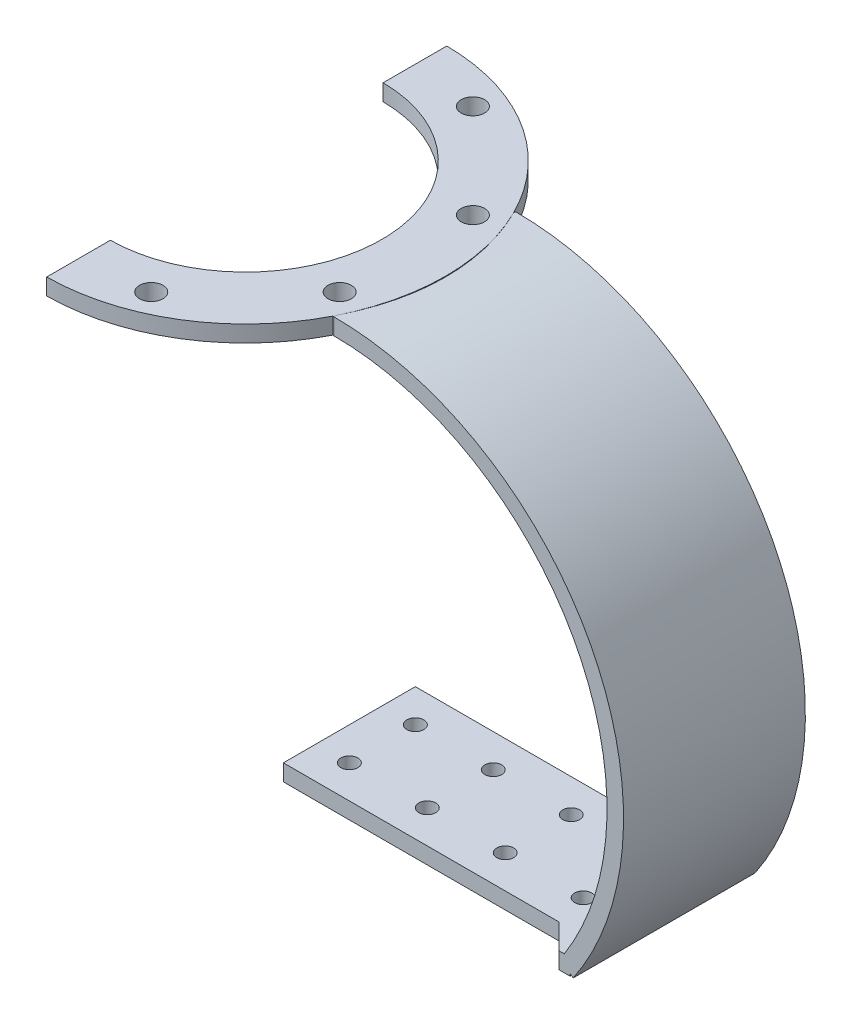
ISO-10303-21;
HEADER;
FILE_DESCRIPTION(('STEP AP214'),'2;1');
FILE_NAME('part.step','',(''),(''),'','','');
FILE_SCHEMA(('AUTOMOTIVE_DESIGN { 1 0 10303 214 1 1 1 1 }'));
ENDSEC;
DATA;
#1=APPLICATION_CONTEXT('core data for automotive mechanical design processes');
#2=APPLICATION_PROTOCOL_DEFINITION('international standard','automotive_design',2000,#1);
#3=PRODUCT_CONTEXT('',#1,'mechanical');
#4=PRODUCT('Part','Part','',(#3));
#5=PRODUCT_RELATED_PRODUCT_CATEGORY('part','',(#4));
#6=PRODUCT_DEFINITION_FORMATION('','',#4);
#7=PRODUCT_DEFINITION_CONTEXT('part definition',#1,'design');
#8=PRODUCT_DEFINITION('design','',#6,#7);
#9=PRODUCT_DEFINITION_SHAPE('','',#8);
#10=(LENGTH_UNIT() NAMED_UNIT(*) SI_UNIT(.MILLI.,.METRE.));
#11=(NAMED_UNIT(*) PLANE_ANGLE_UNIT() SI_UNIT($,.RADIAN.));
#12=(NAMED_UNIT(*) SI_UNIT($,.STERADIAN.) SOLID_ANGLE_UNIT());
#13=UNCERTAINTY_MEASURE_WITH_UNIT(LENGTH_MEASURE(1.E-05),#10,'distance_accuracy_value','');
#14=(GEOMETRIC_REPRESENTATION_CONTEXT(3) GLOBAL_UNCERTAINTY_ASSIGNED_CONTEXT((#13)) GLOBAL_UNIT_ASSIGNED_CONTEXT((#10,
#11,#12)) REPRESENTATION_CONTEXT('',''));
#15=CARTESIAN_POINT('',(0.,0.,0.));
#16=DIRECTION('',(0.,0.,1.));
#17=DIRECTION('',(1.,0.,0.));
#18=AXIS2_PLACEMENT_3D('',#15,#16,#17);
#19=CARTESIAN_POINT('',(0.,84.005,0.));
#20=DIRECTION('',(0.,1.,0.));
#21=DIRECTION('',(0.,0.,1.));
#22=AXIS2_PLACEMENT_3D('',#19,#20,#21);
#23=CYLINDRICAL_SURFACE('',#22,38.5);
#24=CARTESIAN_POINT('',(0.,87.18,0.));
#25=DIRECTION('',(0.,1.,0.));
#26=DIRECTION('',(0.,0.,1.));
#27=AXIS2_PLACEMENT_3D('',#24,#25,#26);
#28=CIRCLE('',#27,38.5);
#29=CARTESIAN_POINT('',(34.5,87.18,-17.0880074906351));
#30=VERTEX_POINT('',#29);
#31=CARTESIAN_POINT('',(0.250000000000008,87.18,-38.4991883031318));
#32=VERTEX_POINT('',#31);
#33=EDGE_CURVE('E323',#30,#32,#28,.T.);
#34=ORIENTED_EDGE('',*,*,#33,.F.);
#35=DIRECTION('',(0.,1.,0.));
#36=VECTOR('',#35,1.);
#37=CARTESIAN_POINT('',(34.5,84.005,-17.0880074906351));
#38=LINE('',#37,#36);
#39=CARTESIAN_POINT('',(34.5,84.005,-17.0880074906351));
#40=VERTEX_POINT('',#39);
#41=EDGE_CURVE('E249',#30,#40,#38,.F.);
#42=ORIENTED_EDGE('',*,*,#41,.T.);
#43=CARTESIAN_POINT('',(0.,84.005,0.));
#44=DIRECTION('',(0.,1.,0.));
#45=DIRECTION('',(0.,0.,1.));
#46=AXIS2_PLACEMENT_3D('',#43,#44,#45);
#47=CIRCLE('',#46,38.5);
#48=CARTESIAN_POINT('',(0.250000000000008,84.005,-38.4991883031318));
#49=VERTEX_POINT('',#48);
#50=EDGE_CURVE('E388',#40,#49,#47,.T.);
#51=ORIENTED_EDGE('',*,*,#50,.T.);
#52=DIRECTION('',(0.,1.,0.));
#53=VECTOR('',#52,1.);
#54=CARTESIAN_POINT('',(0.250000000000008,84.005,-38.4991883031318));
#55=LINE('',#54,#53);
#56=EDGE_CURVE('E349',#49,#32,#55,.T.);
#57=ORIENTED_EDGE('',*,*,#56,.T.);
#58=EDGE_LOOP('',(#34,#42,#51,#57));
#59=FACE_BOUND('',#58,.T.);
#60=ADVANCED_FACE('F40',(#59),#23,.T.);
#61=CARTESIAN_POINT('',(0.250000000000008,84.005,38.4991883031318));
#62=VERTEX_POINT('',#61);
#63=CARTESIAN_POINT('',(34.3043572998505,84.005,17.4774446142506));
#64=VERTEX_POINT('',#63);
#65=EDGE_CURVE('E380',#62,#64,#47,.T.);
#66=ORIENTED_EDGE('',*,*,#65,.T.);
#67=DIRECTION('',(0.,1.,0.));
#68=VECTOR('',#67,1.);
#69=CARTESIAN_POINT('',(34.3043572998505,84.005,17.4774446142506));
#70=LINE('',#69,#68);
#71=CARTESIAN_POINT('',(34.3043572998505,87.18,17.4774446142506));
#72=VERTEX_POINT('',#71);
#73=EDGE_CURVE('E369',#64,#72,#70,.T.);
#74=ORIENTED_EDGE('',*,*,#73,.T.);
#75=CARTESIAN_POINT('',(0.250000000000008,87.18,38.4991883031318));
#76=VERTEX_POINT('',#75);
#77=EDGE_CURVE('E322',#76,#72,#28,.T.);
#78=ORIENTED_EDGE('',*,*,#77,.F.);
#79=DIRECTION('',(0.,1.,0.));
#80=VECTOR('',#79,1.);
#81=CARTESIAN_POINT('',(0.250000000000008,84.005,38.4991883031318));
#82=LINE('',#81,#80);
#83=EDGE_CURVE('E352',#62,#76,#82,.T.);
#84=ORIENTED_EDGE('',*,*,#83,.F.);
#85=EDGE_LOOP('',(#66,#74,#78,#84));
#86=FACE_BOUND('',#85,.T.);
#87=ADVANCED_FACE('F307',(#86),#23,.T.);
#88=CARTESIAN_POINT('',(34.5,87.18,17.0880074906351));
#89=VERTEX_POINT('',#88);
#90=EDGE_CURVE('E320',#89,#30,#28,.T.);
#91=ORIENTED_EDGE('',*,*,#90,.F.);
#92=CARTESIAN_POINT('',(34.5,87.18,17.0880074906351));
#93=CARTESIAN_POINT('',(34.7401927640667,87.1799907951061,16.6030828400303));
#94=CARTESIAN_POINT('',(34.9701457065483,87.178447928796,16.1130960920916));
#95=CARTESIAN_POINT('',(35.4091913129783,87.1730228010982,15.1238839267135));
#96=CARTESIAN_POINT('',(35.6182842464073,87.1691405699361,14.6246586287212));
#97=CARTESIAN_POINT('',(36.0152270544095,87.1597648001595,13.6178635447017));
#98=CARTESIAN_POINT('',(36.2030778245849,87.1542713295123,13.1102941115103));
#99=CARTESIAN_POINT('',(36.5572091053214,87.1423241961017,12.0877344994361));
#100=CARTESIAN_POINT('',(36.7234895768662,87.1358705316016,11.5727443071327));
#101=CARTESIAN_POINT('',(37.1892608084199,87.1159940373502,10.0188357442367));
#102=CARTESIAN_POINT('',(37.4560986698537,87.1020432835709,8.96992051816567));
#103=CARTESIAN_POINT('',(37.9005169318116,87.0766727235012,6.85349520160396));
#104=CARTESIAN_POINT('',(38.0780997773165,87.0652528478866,5.78598562130117));
#105=CARTESIAN_POINT('',(38.3429186735553,87.0475958289183,3.63887190418253));
#106=CARTESIAN_POINT('',(38.4300827573942,87.041362814716,2.55925882356517));
#107=CARTESIAN_POINT('',(38.5131676446332,87.0354310203258,0.396450495344081));
#108=CARTESIAN_POINT('',(38.5090831864638,87.0357326169362,-0.686744955225307));
#109=CARTESIAN_POINT('',(38.4097312263332,87.0428032052197,-2.84822175972691));
#110=CARTESIAN_POINT('',(38.3145210417669,87.0495681315025,-3.92650577457537));
#111=CARTESIAN_POINT('',(38.0336858521719,87.0681118727003,-6.07105913989562));
#112=CARTESIAN_POINT('',(37.8480780515927,87.0798897335013,-7.13733073707534));
#113=CARTESIAN_POINT('',(37.4503465626107,87.1021519162474,-8.96338799679643));
#114=CARTESIAN_POINT('',(37.2590978343101,87.1121194886817,-9.72779945225761));
#115=CARTESIAN_POINT('',(36.8301090226141,87.1317140108851,-11.2433575823781));
#116=CARTESIAN_POINT('',(36.5923776665228,87.1413410241955,-11.994506718272));
#117=CARTESIAN_POINT('',(36.0714173850146,87.1584676330549,-13.4804395820254));
#118=CARTESIAN_POINT('',(35.7882120005232,87.165968323829,-14.2152315547382));
#119=CARTESIAN_POINT('',(35.177246424625,87.1767129488566,-15.6662628992205));
#120=CARTESIAN_POINT('',(34.8494769300242,87.1799559927741,-16.3824983598676));
#121=CARTESIAN_POINT('',(34.5,87.18,-17.0880074906351));
#122=B_SPLINE_CURVE_WITH_KNOTS('',3,(#92,#93,#94,#95,#96,#97,#98,#99,#100,#101,#102,#103,#104,
#105,#106,#107,#108,#109,#110,#111,#112,#113,#114,#115,#116,#117,#118,#119,#120,#121),
.UNSPECIFIED.,.F.,.F.,(4,2,2,2,2,2,2,2,2,2,2,2,2,2,4),(0.,1.62331568564605,3.24661039772908,
4.86983664367539,6.49306582566813,9.73612046284146,12.979086257514,16.2246312461284,
19.4703633797002,22.7140553129832,25.9571301488043,28.3198546750462,30.6821360153004,
33.0431983728157,35.4047543841795),.UNSPECIFIED.);
#123=EDGE_CURVE('E240',#89,#30,#122,.T.);
#124=ORIENTED_EDGE('',*,*,#123,.T.);
#125=EDGE_LOOP('',(#91,#124));
#126=FACE_BOUND('',#125,.T.);
#127=ADVANCED_FACE('F302',(#126),#23,.T.);
#128=CARTESIAN_POINT('',(0.,84.005,0.));
#129=DIRECTION('',(0.,1.,0.));
#130=DIRECTION('',(0.,0.,1.));
#131=AXIS2_PLACEMENT_3D('',#128,#129,#130);
#132=CYLINDRICAL_SURFACE('',#131,26.25);
#133=CARTESIAN_POINT('',(0.,87.18,0.));
#134=DIRECTION('',(0.,1.,0.));
#135=DIRECTION('',(0.,0.,1.));
#136=AXIS2_PLACEMENT_3D('',#133,#134,#135);
#137=CIRCLE('',#136,26.25);
#138=CARTESIAN_POINT('',(0.250000000000008,87.18,26.2488094968134));
#139=VERTEX_POINT('',#138);
#140=CARTESIAN_POINT('',(0.250000000000008,87.18,-26.2488094968134));
#141=VERTEX_POINT('',#140);
#142=EDGE_CURVE('E400',#139,#141,#137,.T.);
#143=ORIENTED_EDGE('',*,*,#142,.T.);
#144=DIRECTION('',(0.,1.,0.));
#145=VECTOR('',#144,1.);
#146=CARTESIAN_POINT('',(0.250000000000008,84.005,-26.2488094968134));
#147=LINE('',#146,#145);
#148=CARTESIAN_POINT('',(0.250000000000008,84.005,-26.2488094968134));
#149=VERTEX_POINT('',#148);
#150=EDGE_CURVE('E346',#149,#141,#147,.T.);
#151=ORIENTED_EDGE('',*,*,#150,.F.);
#152=CARTESIAN_POINT('',(0.,84.005,0.));
#153=DIRECTION('',(0.,1.,0.));
#154=DIRECTION('',(0.,0.,1.));
#155=AXIS2_PLACEMENT_3D('',#152,#153,#154);
#156=CIRCLE('',#155,26.25);
#157=CARTESIAN_POINT('',(0.250000000000008,84.005,26.2488094968134));
#158=VERTEX_POINT('',#157);
#159=EDGE_CURVE('E345',#158,#149,#156,.T.);
#160=ORIENTED_EDGE('',*,*,#159,.F.);
#161=DIRECTION('',(0.,1.,0.));
#162=VECTOR('',#161,1.);
#163=CARTESIAN_POINT('',(0.250000000000008,84.005,26.2488094968134));
#164=LINE('',#163,#162);
#165=EDGE_CURVE('E354',#158,#139,#164,.T.);
#166=ORIENTED_EDGE('',*,*,#165,.T.);
#167=EDGE_LOOP('',(#143,#151,#160,#166));
#168=FACE_BOUND('',#167,.T.);
#169=ADVANCED_FACE('F297',(#168),#132,.F.);
#170=CARTESIAN_POINT('',(0.250000000000008,84.005,0.));
#171=DIRECTION('',(-1.,0.,0.));
#172=DIRECTION('',(0.,0.,1.));
#173=AXIS2_PLACEMENT_3D('',#170,#171,#172);
#174=PLANE('',#173);
#175=DIRECTION('',(0.,0.,1.));
#176=VECTOR('',#175,1.);
#177=CARTESIAN_POINT('',(0.250000000000008,87.18,0.));
#178=LINE('',#177,#176);
#179=EDGE_CURVE('E326',#32,#141,#178,.T.);
#180=ORIENTED_EDGE('',*,*,#179,.F.);
#181=ORIENTED_EDGE('',*,*,#56,.F.);
#182=DIRECTION('',(0.,0.,1.));
#183=VECTOR('',#182,1.);
#184=CARTESIAN_POINT('',(0.250000000000008,84.005,0.));
#185=LINE('',#184,#183);
#186=EDGE_CURVE('E387',#49,#149,#185,.T.);
#187=ORIENTED_EDGE('',*,*,#186,.T.);
#188=ORIENTED_EDGE('',*,*,#150,.T.);
#189=EDGE_LOOP('',(#180,#181,#187,#188));
#190=FACE_BOUND('',#189,.T.);
#191=ADVANCED_FACE('F288',(#190),#174,.T.);
#192=CARTESIAN_POINT('',(30.9499643391282,84.005,12.8198949842303));
#193=DIRECTION('',(0.,1.,0.));
#194=DIRECTION('',(0.,0.,1.));
#195=AXIS2_PLACEMENT_3D('',#192,#193,#194);
#196=CYLINDRICAL_SURFACE('',#195,2.25);
#197=CARTESIAN_POINT('',(30.9499643391282,84.005,12.8198949842303));
#198=DIRECTION('',(0.,1.,0.));
#199=DIRECTION('',(0.,0.,1.));
#200=AXIS2_PLACEMENT_3D('',#197,#198,#199);
#201=CIRCLE('',#200,2.25);
#202=CARTESIAN_POINT('',(30.9499643391282,84.005,15.0698949842303));
#203=VERTEX_POINT('',#202);
#204=EDGE_CURVE('E407',#203,#203,#201,.T.);
#205=ORIENTED_EDGE('',*,*,#204,.F.);
#206=EDGE_LOOP('',(#205));
#207=FACE_BOUND('',#206,.T.);
#208=CARTESIAN_POINT('',(30.9499643391282,87.18,12.8198949842303));
#209=DIRECTION('',(0.,1.,0.));
#210=DIRECTION('',(0.,0.,1.));
#211=AXIS2_PLACEMENT_3D('',#208,#209,#210);
#212=CIRCLE('',#211,2.25);
#213=CARTESIAN_POINT('',(30.9499643391282,87.18,15.0698949842303));
#214=VERTEX_POINT('',#213);
#215=EDGE_CURVE('E339',#214,#214,#212,.T.);
#216=ORIENTED_EDGE('',*,*,#215,.T.);
#217=EDGE_LOOP('',(#216));
#218=FACE_BOUND('',#217,.T.);
#219=ADVANCED_FACE('F284',(#207,#218),#196,.F.);
#220=CARTESIAN_POINT('',(30.9499643391281,84.005,-12.8198949842307));
#221=DIRECTION('',(0.,1.,0.));
#222=DIRECTION('',(0.,0.,1.));
#223=AXIS2_PLACEMENT_3D('',#220,#221,#222);
#224=CYLINDRICAL_SURFACE('',#223,2.25);
#225=CARTESIAN_POINT('',(30.9499643391281,84.005,-12.8198949842307));
#226=DIRECTION('',(0.,1.,0.));
#227=DIRECTION('',(0.,0.,1.));
#228=AXIS2_PLACEMENT_3D('',#225,#226,#227);
#229=CIRCLE('',#228,2.25);
#230=CARTESIAN_POINT('',(30.9499643391281,84.005,-10.5698949842307));
#231=VERTEX_POINT('',#230);
#232=EDGE_CURVE('E410',#231,#231,#229,.T.);
#233=ORIENTED_EDGE('',*,*,#232,.F.);
#234=EDGE_LOOP('',(#233));
#235=FACE_BOUND('',#234,.T.);
#236=CARTESIAN_POINT('',(30.9499643391281,87.18,-12.8198949842307));
#237=DIRECTION('',(0.,1.,0.));
#238=DIRECTION('',(0.,0.,1.));
#239=AXIS2_PLACEMENT_3D('',#236,#237,#238);
#240=CIRCLE('',#239,2.25);
#241=CARTESIAN_POINT('',(30.9499643391281,87.18,-10.5698949842307));
#242=VERTEX_POINT('',#241);
#243=EDGE_CURVE('E336',#242,#242,#240,.T.);
#244=ORIENTED_EDGE('',*,*,#243,.T.);
#245=EDGE_LOOP('',(#244));
#246=FACE_BOUND('',#245,.T.);
#247=ADVANCED_FACE('F287',(#235,#246),#224,.F.);
#248=CARTESIAN_POINT('',(12.8198949842303,84.005,-30.9499643391282));
#249=DIRECTION('',(0.,1.,0.));
#250=DIRECTION('',(0.,0.,1.));
#251=AXIS2_PLACEMENT_3D('',#248,#249,#250);
#252=CYLINDRICAL_SURFACE('',#251,2.25);
#253=CARTESIAN_POINT('',(12.8198949842303,84.005,-30.9499643391282));
#254=DIRECTION('',(0.,1.,0.));
#255=DIRECTION('',(0.,0.,1.));
#256=AXIS2_PLACEMENT_3D('',#253,#254,#255);
#257=CIRCLE('',#256,2.25);
#258=CARTESIAN_POINT('',(12.8198949842303,84.005,-28.6999643391282));
#259=VERTEX_POINT('',#258);
#260=EDGE_CURVE('E413',#259,#259,#257,.T.);
#261=ORIENTED_EDGE('',*,*,#260,.F.);
#262=EDGE_LOOP('',(#261));
#263=FACE_BOUND('',#262,.T.);
#264=CARTESIAN_POINT('',(12.8198949842303,87.18,-30.9499643391282));
#265=DIRECTION('',(0.,1.,0.));
#266=DIRECTION('',(0.,0.,1.));
#267=AXIS2_PLACEMENT_3D('',#264,#265,#266);
#268=CIRCLE('',#267,2.25);
#269=CARTESIAN_POINT('',(12.8198949842303,87.18,-28.6999643391282));
#270=VERTEX_POINT('',#269);
#271=EDGE_CURVE('E333',#270,#270,#268,.T.);
#272=ORIENTED_EDGE('',*,*,#271,.T.);
#273=EDGE_LOOP('',(#272));
#274=FACE_BOUND('',#273,.T.);
#275=ADVANCED_FACE('F292',(#263,#274),#252,.F.);
#276=CARTESIAN_POINT('',(0.250000000000008,84.005,0.));
#277=DIRECTION('',(1.,0.,0.));
#278=DIRECTION('',(0.,0.,-1.));
#279=AXIS2_PLACEMENT_3D('',#276,#277,#278);
#280=PLANE('',#279);
#281=DIRECTION('',(0.,0.,-1.));
#282=VECTOR('',#281,1.);
#283=CARTESIAN_POINT('',(0.250000000000008,87.18,0.));
#284=LINE('',#283,#282);
#285=EDGE_CURVE('E327',#76,#139,#284,.T.);
#286=ORIENTED_EDGE('',*,*,#285,.T.);
#287=ORIENTED_EDGE('',*,*,#165,.F.);
#288=DIRECTION('',(0.,0.,-1.));
#289=VECTOR('',#288,1.);
#290=CARTESIAN_POINT('',(0.250000000000008,84.005,0.));
#291=LINE('',#290,#289);
#292=EDGE_CURVE('E418',#62,#158,#291,.T.);
#293=ORIENTED_EDGE('',*,*,#292,.F.);
#294=ORIENTED_EDGE('',*,*,#83,.T.);
#295=EDGE_LOOP('',(#286,#287,#293,#294));
#296=FACE_BOUND('',#295,.T.);
#297=ADVANCED_FACE('F282',(#296),#280,.F.);
#298=CARTESIAN_POINT('',(12.8198949842307,84.005,30.949964339128));
#299=DIRECTION('',(0.,1.,0.));
#300=DIRECTION('',(0.,0.,1.));
#301=AXIS2_PLACEMENT_3D('',#298,#299,#300);
#302=CYLINDRICAL_SURFACE('',#301,2.25);
#303=CARTESIAN_POINT('',(12.8198949842307,84.005,30.949964339128));
#304=DIRECTION('',(0.,1.,0.));
#305=DIRECTION('',(0.,0.,1.));
#306=AXIS2_PLACEMENT_3D('',#303,#304,#305);
#307=CIRCLE('',#306,2.25);
#308=CARTESIAN_POINT('',(12.8198949842307,84.005,33.199964339128));
#309=VERTEX_POINT('',#308);
#310=EDGE_CURVE('E357',#309,#309,#307,.T.);
#311=ORIENTED_EDGE('',*,*,#310,.F.);
#312=EDGE_LOOP('',(#311));
#313=FACE_BOUND('',#312,.T.);
#314=CARTESIAN_POINT('',(12.8198949842307,87.18,30.949964339128));
#315=DIRECTION('',(0.,1.,0.));
#316=DIRECTION('',(0.,0.,1.));
#317=AXIS2_PLACEMENT_3D('',#314,#315,#316);
#318=CIRCLE('',#317,2.25);
#319=CARTESIAN_POINT('',(12.8198949842307,87.18,33.199964339128));
#320=VERTEX_POINT('',#319);
#321=EDGE_CURVE('E342',#320,#320,#318,.T.);
#322=ORIENTED_EDGE('',*,*,#321,.T.);
#323=EDGE_LOOP('',(#322));
#324=FACE_BOUND('',#323,.T.);
#325=ADVANCED_FACE('F275',(#313,#324),#302,.F.);
#326=CARTESIAN_POINT('',(0.,84.005,0.));
#327=DIRECTION('',(0.,1.,0.));
#328=DIRECTION('',(0.,0.,1.));
#329=AXIS2_PLACEMENT_3D('',#326,#327,#328);
#330=PLANE('',#329);
#331=ORIENTED_EDGE('',*,*,#50,.F.);
#332=DIRECTION('',(0.,0.,-1.));
#333=VECTOR('',#332,1.);
#334=CARTESIAN_POINT('',(34.5,84.005,17.5));
#335=LINE('',#334,#333);
#336=CARTESIAN_POINT('',(34.5,84.005,17.4980074906351));
#337=VERTEX_POINT('',#336);
#338=EDGE_CURVE('E227',#337,#40,#335,.T.);
#339=ORIENTED_EDGE('',*,*,#338,.F.);
#340=DIRECTION('',(-0.99452189536828,0.,-0.104528463267587));
#341=VECTOR('',#340,1.);
#342=CARTESIAN_POINT('',(-1.44206627431736,84.005,13.7203441010071));
#343=LINE('',#342,#341);
#344=EDGE_CURVE('E50',#337,#64,#343,.T.);
#345=ORIENTED_EDGE('',*,*,#344,.T.);
#346=ORIENTED_EDGE('',*,*,#65,.F.);
#347=ORIENTED_EDGE('',*,*,#292,.T.);
#348=ORIENTED_EDGE('',*,*,#159,.T.);
#349=ORIENTED_EDGE('',*,*,#186,.F.);
#350=EDGE_LOOP('',(#331,#339,#345,#346,#347,#348,#349));
#351=FACE_BOUND('',#350,.T.);
#352=ORIENTED_EDGE('',*,*,#260,.T.);
#353=EDGE_LOOP('',(#352));
#354=FACE_BOUND('',#353,.T.);
#355=ORIENTED_EDGE('',*,*,#232,.T.);
#356=EDGE_LOOP('',(#355));
#357=FACE_BOUND('',#356,.T.);
#358=ORIENTED_EDGE('',*,*,#204,.T.);
#359=EDGE_LOOP('',(#358));
#360=FACE_BOUND('',#359,.T.);
#361=ORIENTED_EDGE('',*,*,#310,.T.);
#362=EDGE_LOOP('',(#361));
#363=FACE_BOUND('',#362,.T.);
#364=ADVANCED_FACE('F271',(#351,#354,#357,#360,#363),#330,.F.);
#365=CARTESIAN_POINT('',(0.,87.18,0.));
#366=DIRECTION('',(0.,1.,0.));
#367=DIRECTION('',(0.,0.,1.));
#368=AXIS2_PLACEMENT_3D('',#365,#366,#367);
#369=PLANE('',#368);
#370=ORIENTED_EDGE('',*,*,#90,.T.);
#371=ORIENTED_EDGE('',*,*,#33,.T.);
#372=ORIENTED_EDGE('',*,*,#179,.T.);
#373=ORIENTED_EDGE('',*,*,#142,.F.);
#374=ORIENTED_EDGE('',*,*,#285,.F.);
#375=ORIENTED_EDGE('',*,*,#77,.T.);
#376=DIRECTION('',(0.99452189536828,0.,0.104528463267587));
#377=VECTOR('',#376,1.);
#378=CARTESIAN_POINT('',(34.3043572998505,87.18,17.4774446142506));
#379=LINE('',#378,#377);
#380=CARTESIAN_POINT('',(34.5,87.18,17.4980074906351));
#381=VERTEX_POINT('',#380);
#382=EDGE_CURVE('E374',#72,#381,#379,.T.);
#383=ORIENTED_EDGE('',*,*,#382,.T.);
#384=DIRECTION('',(0.,0.,1.));
#385=VECTOR('',#384,1.);
#386=CARTESIAN_POINT('',(34.5,87.18,17.2930072856172));
#387=LINE('',#386,#385);
#388=EDGE_CURVE('E11',#89,#381,#387,.T.);
#389=ORIENTED_EDGE('',*,*,#388,.F.);
#390=EDGE_LOOP('',(#370,#371,#372,#373,#374,#375,#383,#389));
#391=FACE_BOUND('',#390,.T.);
#392=ORIENTED_EDGE('',*,*,#271,.F.);
#393=EDGE_LOOP('',(#392));
#394=FACE_BOUND('',#393,.T.);
#395=ORIENTED_EDGE('',*,*,#243,.F.);
#396=EDGE_LOOP('',(#395));
#397=FACE_BOUND('',#396,.T.);
#398=ORIENTED_EDGE('',*,*,#215,.F.);
#399=EDGE_LOOP('',(#398));
#400=FACE_BOUND('',#399,.T.);
#401=ORIENTED_EDGE('',*,*,#321,.F.);
#402=EDGE_LOOP('',(#401));
#403=FACE_BOUND('',#402,.T.);
#404=ADVANCED_FACE('F274',(#391,#394,#397,#400,#403),#369,.T.);
#405=CARTESIAN_POINT('',(34.5,0.,0.));
#406=DIRECTION('',(1.,0.,0.));
#407=DIRECTION('',(0.,0.,-1.));
#408=AXIS2_PLACEMENT_3D('',#405,#406,#407);
#409=PLANE('',#408);
#410=ORIENTED_EDGE('',*,*,#41,.F.);
#411=DIRECTION('',(0.,0.,1.));
#412=VECTOR('',#411,1.);
#413=CARTESIAN_POINT('',(34.5,87.18,17.5));
#414=LINE('',#413,#412);
#415=CARTESIAN_POINT('',(34.5,87.18,-17.5));
#416=VERTEX_POINT('',#415);
#417=EDGE_CURVE('E237',#416,#30,#414,.T.);
#418=ORIENTED_EDGE('',*,*,#417,.F.);
#419=DIRECTION('',(0.,1.,0.));
#420=VECTOR('',#419,1.);
#421=CARTESIAN_POINT('',(34.5,87.18,-17.5));
#422=LINE('',#421,#420);
#423=CARTESIAN_POINT('',(34.5,84.005,-17.5));
#424=VERTEX_POINT('',#423);
#425=EDGE_CURVE('E229',#424,#416,#422,.T.);
#426=ORIENTED_EDGE('',*,*,#425,.F.);
#427=EDGE_CURVE('E219',#40,#424,#335,.T.);
#428=ORIENTED_EDGE('',*,*,#427,.F.);
#429=EDGE_LOOP('',(#410,#418,#426,#428));
#430=FACE_BOUND('',#429,.T.);
#431=ADVANCED_FACE('F261',(#430),#409,.F.);
#432=CARTESIAN_POINT('',(8.54495953955393,49.1050439961304,0.));
#433=DIRECTION('',(-0.563260426658986,-0.82627942716731,0.));
#434=DIRECTION('',(0.,0.,-1.));
#435=AXIS2_PLACEMENT_3D('',#432,#433,#434);
#436=PLANE('',#435);
#437=DIRECTION('',(0.,0.,1.));
#438=VECTOR('',#437,1.);
#439=CARTESIAN_POINT('',(80.,0.395375991124637,0.));
#440=LINE('',#439,#438);
#441=CARTESIAN_POINT('',(80.,0.395375991124622,-17.5));
#442=VERTEX_POINT('',#441);
#443=CARTESIAN_POINT('',(80.,0.395375991124669,17.5));
#444=VERTEX_POINT('',#443);
#445=EDGE_CURVE('E201',#442,#444,#440,.T.);
#446=ORIENTED_EDGE('',*,*,#445,.F.);
#447=DIRECTION('',(0.826279427167309,-0.563260426658986,0.));
#448=VECTOR('',#447,1.);
#449=CARTESIAN_POINT('',(80.58,0.,-17.5));
#450=LINE('',#449,#448);
#451=CARTESIAN_POINT('',(80.58,0.,-17.5));
#452=VERTEX_POINT('',#451);
#453=EDGE_CURVE('E212',#442,#452,#450,.T.);
#454=ORIENTED_EDGE('',*,*,#453,.T.);
#455=DIRECTION('',(0.,0.,1.));
#456=VECTOR('',#455,1.);
#457=CARTESIAN_POINT('',(80.58,0.,17.5));
#458=LINE('',#457,#456);
#459=CARTESIAN_POINT('',(80.58,0.,17.5));
#460=VERTEX_POINT('',#459);
#461=EDGE_CURVE('E222',#452,#460,#458,.T.);
#462=ORIENTED_EDGE('',*,*,#461,.T.);
#463=DIRECTION('',(-0.826279427167309,0.563260426658986,0.));
#464=VECTOR('',#463,1.);
#465=CARTESIAN_POINT('',(80.58,0.,17.5));
#466=LINE('',#465,#464);
#467=EDGE_CURVE('E209',#460,#444,#466,.T.);
#468=ORIENTED_EDGE('',*,*,#467,.T.);
#469=EDGE_LOOP('',(#446,#454,#462,#468));
#470=FACE_BOUND('',#469,.T.);
#471=ADVANCED_FACE('F267',(#470),#436,.T.);
#472=CARTESIAN_POINT('',(34.5,87.18,17.5));
#473=VERTEX_POINT('',#472);
#474=EDGE_CURVE('E56',#381,#473,#414,.T.);
#475=ORIENTED_EDGE('',*,*,#474,.F.);
#476=DIRECTION('',(0.,-1.,0.));
#477=VECTOR('',#476,1.);
#478=CARTESIAN_POINT('',(34.5,0.,17.4980074906351));
#479=LINE('',#478,#477);
#480=EDGE_CURVE('E372',#381,#337,#479,.T.);
#481=ORIENTED_EDGE('',*,*,#480,.T.);
#482=CARTESIAN_POINT('',(34.5,84.005,17.5));
#483=VERTEX_POINT('',#482);
#484=EDGE_CURVE('E223',#483,#337,#335,.T.);
#485=ORIENTED_EDGE('',*,*,#484,.F.);
#486=DIRECTION('',(0.,-1.,0.));
#487=VECTOR('',#486,1.);
#488=CARTESIAN_POINT('',(34.5,87.18,17.5));
#489=LINE('',#488,#487);
#490=EDGE_CURVE('E213',#473,#483,#489,.T.);
#491=ORIENTED_EDGE('',*,*,#490,.F.);
#492=EDGE_LOOP('',(#475,#481,#485,#491));
#493=FACE_BOUND('',#492,.T.);
#494=ADVANCED_FACE('F263',(#493),#409,.F.);
#495=CARTESIAN_POINT('',(80.58,0.,17.5));
#496=DIRECTION('',(0.,0.,-1.));
#497=DIRECTION('',(-1.,0.,0.));
#498=AXIS2_PLACEMENT_3D('',#495,#496,#497);
#499=PLANE('',#498);
#500=DIRECTION('',(0.,-1.,0.));
#501=VECTOR('',#500,1.);
#502=CARTESIAN_POINT('',(80.,3.175,17.5));
#503=LINE('',#502,#501);
#504=CARTESIAN_POINT('',(80.,0.,17.5));
#505=VERTEX_POINT('',#504);
#506=EDGE_CURVE('E204',#444,#505,#503,.T.);
#507=ORIENTED_EDGE('',*,*,#506,.F.);
#508=ORIENTED_EDGE('',*,*,#467,.F.);
#509=CARTESIAN_POINT('',(34.5,31.4119408121129,17.5));
#510=DIRECTION('',(0.,0.,1.));
#511=DIRECTION('',(0.826279427167309,-0.563260426658986,0.));
#512=AXIS2_PLACEMENT_3D('',#509,#510,#511);
#513=CIRCLE('',#512,55.7680591878871);
#514=EDGE_CURVE('E217',#460,#473,#513,.T.);
#515=ORIENTED_EDGE('',*,*,#514,.T.);
#516=ORIENTED_EDGE('',*,*,#490,.T.);
#517=CARTESIAN_POINT('',(34.5,31.4119408121129,17.5));
#518=DIRECTION('',(0.,0.,1.));
#519=DIRECTION('',(0.826279427167309,-0.563260426658986,0.));
#520=AXIS2_PLACEMENT_3D('',#517,#518,#519);
#521=CIRCLE('',#520,52.5930591878871);
#522=CARTESIAN_POINT('',(78.870091822238,3.175,17.5));
#523=VERTEX_POINT('',#522);
#524=EDGE_CURVE('E216',#523,#483,#521,.T.);
#525=ORIENTED_EDGE('',*,*,#524,.F.);
#526=DIRECTION('',(1.,0.,0.));
#527=VECTOR('',#526,1.);
#528=CARTESIAN_POINT('',(0.,3.175,17.5));
#529=LINE('',#528,#527);
#530=CARTESIAN_POINT('',(77.84,3.175,17.5));
#531=VERTEX_POINT('',#530);
#532=EDGE_CURVE('E183',#531,#523,#529,.T.);
#533=ORIENTED_EDGE('',*,*,#532,.F.);
#534=DIRECTION('',(0.,-1.,0.));
#535=VECTOR('',#534,1.);
#536=CARTESIAN_POINT('',(77.84,3.175,17.5));
#537=LINE('',#536,#535);
#538=CARTESIAN_POINT('',(77.84,0.,17.5));
#539=VERTEX_POINT('',#538);
#540=EDGE_CURVE('E198',#531,#539,#537,.T.);
#541=ORIENTED_EDGE('',*,*,#540,.T.);
#542=DIRECTION('',(1.,0.,0.));
#543=VECTOR('',#542,1.);
#544=CARTESIAN_POINT('',(0.,0.,17.5));
#545=LINE('',#544,#543);
#546=EDGE_CURVE('E485',#539,#505,#545,.T.);
#547=ORIENTED_EDGE('',*,*,#546,.T.);
#548=EDGE_LOOP('',(#507,#508,#515,#516,#525,#533,#541,#547));
#549=FACE_BOUND('',#548,.T.);
#550=ADVANCED_FACE('F266',(#549),#499,.F.);
#551=CARTESIAN_POINT('',(34.5,31.4119408121129,17.5));
#552=DIRECTION('',(0.,0.,1.));
#553=DIRECTION('',(1.,0.,0.));
#554=AXIS2_PLACEMENT_3D('',#551,#552,#553);
#555=CYLINDRICAL_SURFACE('',#554,52.5930591878871);
#556=CARTESIAN_POINT('',(34.5,31.4119408121129,-17.5));
#557=DIRECTION('',(0.,0.,1.));
#558=DIRECTION('',(0.826279427167309,-0.563260426658986,0.));
#559=AXIS2_PLACEMENT_3D('',#556,#557,#558);
#560=CIRCLE('',#559,52.5930591878871);
#561=CARTESIAN_POINT('',(78.870091822238,3.175,-17.5));
#562=VERTEX_POINT('',#561);
#563=EDGE_CURVE('E226',#562,#424,#560,.T.);
#564=ORIENTED_EDGE('',*,*,#563,.F.);
#565=DIRECTION('',(0.,0.,1.));
#566=VECTOR('',#565,1.);
#567=CARTESIAN_POINT('',(78.870091822238,3.175,17.5));
#568=LINE('',#567,#566);
#569=EDGE_CURVE('E197',#562,#523,#568,.T.);
#570=ORIENTED_EDGE('',*,*,#569,.T.);
#571=ORIENTED_EDGE('',*,*,#524,.T.);
#572=ORIENTED_EDGE('',*,*,#484,.T.);
#573=ORIENTED_EDGE('',*,*,#338,.T.);
#574=ORIENTED_EDGE('',*,*,#427,.T.);
#575=EDGE_LOOP('',(#564,#570,#571,#572,#573,#574));
#576=FACE_BOUND('',#575,.T.);
#577=ADVANCED_FACE('F564',(#576),#555,.F.);
#578=CARTESIAN_POINT('',(80.58,0.,-17.5));
#579=DIRECTION('',(0.,0.,1.));
#580=DIRECTION('',(1.,0.,0.));
#581=AXIS2_PLACEMENT_3D('',#578,#579,#580);
#582=PLANE('',#581);
#583=ORIENTED_EDGE('',*,*,#453,.F.);
#584=DIRECTION('',(0.,-1.,0.));
#585=VECTOR('',#584,1.);
#586=CARTESIAN_POINT('',(80.,3.175,-17.5));
#587=LINE('',#586,#585);
#588=CARTESIAN_POINT('',(80.,0.,-17.5));
#589=VERTEX_POINT('',#588);
#590=EDGE_CURVE('E501',#442,#589,#587,.T.);
#591=ORIENTED_EDGE('',*,*,#590,.T.);
#592=DIRECTION('',(1.,0.,0.));
#593=VECTOR('',#592,1.);
#594=CARTESIAN_POINT('',(0.,0.,-17.5));
#595=LINE('',#594,#593);
#596=CARTESIAN_POINT('',(77.84,0.,-17.5));
#597=VERTEX_POINT('',#596);
#598=EDGE_CURVE('E490',#597,#589,#595,.T.);
#599=ORIENTED_EDGE('',*,*,#598,.F.);
#600=DIRECTION('',(0.,-1.,0.));
#601=VECTOR('',#600,1.);
#602=CARTESIAN_POINT('',(77.84,3.175,-17.5));
#603=LINE('',#602,#601);
#604=CARTESIAN_POINT('',(77.84,3.175,-17.5));
#605=VERTEX_POINT('',#604);
#606=EDGE_CURVE('E498',#605,#597,#603,.T.);
#607=ORIENTED_EDGE('',*,*,#606,.F.);
#608=DIRECTION('',(1.,0.,0.));
#609=VECTOR('',#608,1.);
#610=CARTESIAN_POINT('',(0.,3.175,-17.5));
#611=LINE('',#610,#609);
#612=EDGE_CURVE('E451',#605,#562,#611,.T.);
#613=ORIENTED_EDGE('',*,*,#612,.T.);
#614=ORIENTED_EDGE('',*,*,#563,.T.);
#615=ORIENTED_EDGE('',*,*,#425,.T.);
#616=CARTESIAN_POINT('',(34.5,31.4119408121129,-17.5));
#617=DIRECTION('',(0.,0.,1.));
#618=DIRECTION('',(0.826279427167309,-0.563260426658986,0.));
#619=AXIS2_PLACEMENT_3D('',#616,#617,#618);
#620=CIRCLE('',#619,55.7680591878871);
#621=EDGE_CURVE('E232',#452,#416,#620,.T.);
#622=ORIENTED_EDGE('',*,*,#621,.F.);
#623=EDGE_LOOP('',(#583,#591,#599,#607,#613,#614,#615,#622));
#624=FACE_BOUND('',#623,.T.);
#625=ADVANCED_FACE('F259',(#624),#582,.F.);
#626=CARTESIAN_POINT('',(34.5,31.4119408121129,17.5));
#627=DIRECTION('',(0.,0.,1.));
#628=DIRECTION('',(1.,0.,0.));
#629=AXIS2_PLACEMENT_3D('',#626,#627,#628);
#630=CYLINDRICAL_SURFACE('',#629,55.7680591878871);
#631=ORIENTED_EDGE('',*,*,#123,.F.);
#632=ORIENTED_EDGE('',*,*,#388,.T.);
#633=ORIENTED_EDGE('',*,*,#474,.T.);
#634=ORIENTED_EDGE('',*,*,#514,.F.);
#635=ORIENTED_EDGE('',*,*,#461,.F.);
#636=ORIENTED_EDGE('',*,*,#621,.T.);
#637=ORIENTED_EDGE('',*,*,#417,.T.);
#638=EDGE_LOOP('',(#631,#632,#633,#634,#635,#636,#637));
#639=FACE_BOUND('',#638,.T.);
#640=ADVANCED_FACE('F254',(#639),#630,.T.);
#641=CARTESIAN_POINT('',(0.,3.175,0.));
#642=DIRECTION('',(0.,1.,0.));
#643=DIRECTION('',(0.,0.,1.));
#644=AXIS2_PLACEMENT_3D('',#641,#642,#643);
#645=PLANE('',#644);
#646=CARTESIAN_POINT('',(26.35,3.175,-6.35));
#647=DIRECTION('',(0.,1.,0.));
#648=DIRECTION('',(0.,0.,1.));
#649=AXIS2_PLACEMENT_3D('',#646,#647,#648);
#650=CIRCLE('',#649,1.63);
#651=CARTESIAN_POINT('',(26.35,3.175,-4.72));
#652=VERTEX_POINT('',#651);
#653=EDGE_CURVE('E192',#652,#652,#650,.T.);
#654=ORIENTED_EDGE('',*,*,#653,.F.);
#655=EDGE_LOOP('',(#654));
#656=FACE_BOUND('',#655,.T.);
#657=CARTESIAN_POINT('',(41.35,3.175,-6.35));
#658=DIRECTION('',(0.,1.,0.));
#659=DIRECTION('',(0.,0.,1.));
#660=AXIS2_PLACEMENT_3D('',#657,#658,#659);
#661=CIRCLE('',#660,1.63);
#662=CARTESIAN_POINT('',(41.35,3.175,-4.72));
#663=VERTEX_POINT('',#662);
#664=EDGE_CURVE('E813',#663,#663,#661,.T.);
#665=ORIENTED_EDGE('',*,*,#664,.F.);
#666=EDGE_LOOP('',(#665));
#667=FACE_BOUND('',#666,.T.);
#668=CARTESIAN_POINT('',(56.35,3.175,-6.35));
#669=DIRECTION('',(0.,1.,0.));
#670=DIRECTION('',(0.,0.,1.));
#671=AXIS2_PLACEMENT_3D('',#668,#669,#670);
#672=CIRCLE('',#671,1.63000000000001);
#673=CARTESIAN_POINT('',(56.35,3.175,-4.71999999999999));
#674=VERTEX_POINT('',#673);
#675=EDGE_CURVE('E817',#674,#674,#672,.T.);
#676=ORIENTED_EDGE('',*,*,#675,.F.);
#677=EDGE_LOOP('',(#676));
#678=FACE_BOUND('',#677,.T.);
#679=CARTESIAN_POINT('',(41.35,3.175,6.35));
#680=DIRECTION('',(0.,1.,0.));
#681=DIRECTION('',(0.,0.,1.));
#682=AXIS2_PLACEMENT_3D('',#679,#680,#681);
#683=CIRCLE('',#682,1.63);
#684=CARTESIAN_POINT('',(41.35,3.175,7.98));
#685=VERTEX_POINT('',#684);
#686=EDGE_CURVE('E821',#685,#685,#683,.T.);
#687=ORIENTED_EDGE('',*,*,#686,.F.);
#688=EDGE_LOOP('',(#687));
#689=FACE_BOUND('',#688,.T.);
#690=CARTESIAN_POINT('',(56.35,3.175,6.35));
#691=DIRECTION('',(0.,1.,0.));
#692=DIRECTION('',(0.,0.,1.));
#693=AXIS2_PLACEMENT_3D('',#690,#691,#692);
#694=CIRCLE('',#693,1.63000000000001);
#695=CARTESIAN_POINT('',(56.35,3.175,7.98000000000001));
#696=VERTEX_POINT('',#695);
#697=EDGE_CURVE('E825',#696,#696,#694,.T.);
#698=ORIENTED_EDGE('',*,*,#697,.F.);
#699=EDGE_LOOP('',(#698));
#700=FACE_BOUND('',#699,.T.);
#701=CARTESIAN_POINT('',(26.35,3.175,6.35));
#702=DIRECTION('',(0.,1.,0.));
#703=DIRECTION('',(0.,0.,1.));
#704=AXIS2_PLACEMENT_3D('',#701,#702,#703);
#705=CIRCLE('',#704,1.63);
#706=CARTESIAN_POINT('',(26.35,3.175,7.98));
#707=VERTEX_POINT('',#706);
#708=EDGE_CURVE('E829',#707,#707,#705,.T.);
#709=ORIENTED_EDGE('',*,*,#708,.F.);
#710=EDGE_LOOP('',(#709));
#711=FACE_BOUND('',#710,.T.);
#712=CARTESIAN_POINT('',(71.35,3.175,-6.35));
#713=DIRECTION('',(0.,1.,0.));
#714=DIRECTION('',(0.,0.,1.));
#715=AXIS2_PLACEMENT_3D('',#712,#713,#714);
#716=CIRCLE('',#715,1.63000000000001);
#717=CARTESIAN_POINT('',(71.35,3.175,-4.71999999999999));
#718=VERTEX_POINT('',#717);
#719=EDGE_CURVE('E833',#718,#718,#716,.T.);
#720=ORIENTED_EDGE('',*,*,#719,.F.);
#721=EDGE_LOOP('',(#720));
#722=FACE_BOUND('',#721,.T.);
#723=CARTESIAN_POINT('',(71.35,3.175,6.35));
#724=DIRECTION('',(0.,1.,0.));
#725=DIRECTION('',(0.,0.,1.));
#726=AXIS2_PLACEMENT_3D('',#723,#724,#725);
#727=CIRCLE('',#726,1.63000000000001);
#728=CARTESIAN_POINT('',(71.35,3.175,7.98000000000001));
#729=VERTEX_POINT('',#728);
#730=EDGE_CURVE('E496',#729,#729,#727,.T.);
#731=ORIENTED_EDGE('',*,*,#730,.F.);
#732=EDGE_LOOP('',(#731));
#733=FACE_BOUND('',#732,.T.);
#734=ORIENTED_EDGE('',*,*,#569,.F.);
#735=ORIENTED_EDGE('',*,*,#612,.F.);
#736=DIRECTION('',(-0.707106781186551,0.,0.707106781186544));
#737=VECTOR('',#736,1.);
#738=CARTESIAN_POINT('',(73.04,3.175,-12.7));
#739=LINE('',#738,#737);
#740=CARTESIAN_POINT('',(73.04,3.175,-12.7));
#741=VERTEX_POINT('',#740);
#742=EDGE_CURVE('E363',#605,#741,#739,.T.);
#743=ORIENTED_EDGE('',*,*,#742,.T.);
#744=DIRECTION('',(1.,0.,0.));
#745=VECTOR('',#744,1.);
#746=CARTESIAN_POINT('',(0.,3.175,-12.7));
#747=LINE('',#746,#745);
#748=CARTESIAN_POINT('',(20.,3.175,-12.7));
#749=VERTEX_POINT('',#748);
#750=EDGE_CURVE('E190',#749,#741,#747,.T.);
#751=ORIENTED_EDGE('',*,*,#750,.F.);
#752=DIRECTION('',(0.,0.,1.));
#753=VECTOR('',#752,1.);
#754=CARTESIAN_POINT('',(20.,3.175,0.));
#755=LINE('',#754,#753);
#756=CARTESIAN_POINT('',(20.,3.175,12.7));
#757=VERTEX_POINT('',#756);
#758=EDGE_CURVE('E184',#749,#757,#755,.T.);
#759=ORIENTED_EDGE('',*,*,#758,.T.);
#760=DIRECTION('',(1.,0.,0.));
#761=VECTOR('',#760,1.);
#762=CARTESIAN_POINT('',(0.,3.175,12.7));
#763=LINE('',#762,#761);
#764=CARTESIAN_POINT('',(73.04,3.175,12.7));
#765=VERTEX_POINT('',#764);
#766=EDGE_CURVE('E172',#757,#765,#763,.T.);
#767=ORIENTED_EDGE('',*,*,#766,.T.);
#768=DIRECTION('',(-0.707106781186543,0.,-0.707106781186552));
#769=VECTOR('',#768,1.);
#770=CARTESIAN_POINT('',(77.84,3.175,17.5));
#771=LINE('',#770,#769);
#772=EDGE_CURVE('E367',#765,#531,#771,.F.);
#773=ORIENTED_EDGE('',*,*,#772,.T.);
#774=ORIENTED_EDGE('',*,*,#532,.T.);
#775=EDGE_LOOP('',(#734,#735,#743,#751,#759,#767,#773,#774));
#776=FACE_BOUND('',#775,.T.);
#777=ADVANCED_FACE('F188',(#656,#667,#678,#689,#700,#711,#722,#733,#776),#645,.T.);
#778=CARTESIAN_POINT('',(20.,3.175,0.));
#779=DIRECTION('',(1.,0.,0.));
#780=DIRECTION('',(0.,0.,-1.));
#781=AXIS2_PLACEMENT_3D('',#778,#779,#780);
#782=PLANE('',#781);
#783=DIRECTION('',(0.,0.,1.));
#784=VECTOR('',#783,1.);
#785=CARTESIAN_POINT('',(20.,0.,0.));
#786=LINE('',#785,#784);
#787=CARTESIAN_POINT('',(20.,0.,-12.7));
#788=VERTEX_POINT('',#787);
#789=CARTESIAN_POINT('',(20.,0.,12.7));
#790=VERTEX_POINT('',#789);
#791=EDGE_CURVE('E196',#788,#790,#786,.T.);
#792=ORIENTED_EDGE('',*,*,#791,.T.);
#793=DIRECTION('',(0.,-1.,0.));
#794=VECTOR('',#793,1.);
#795=CARTESIAN_POINT('',(20.,3.175,12.7));
#796=LINE('',#795,#794);
#797=EDGE_CURVE('E177',#757,#790,#796,.T.);
#798=ORIENTED_EDGE('',*,*,#797,.F.);
#799=ORIENTED_EDGE('',*,*,#758,.F.);
#800=DIRECTION('',(0.,-1.,0.));
#801=VECTOR('',#800,1.);
#802=CARTESIAN_POINT('',(20.,3.175,-12.7));
#803=LINE('',#802,#801);
#804=EDGE_CURVE('E457',#749,#788,#803,.T.);
#805=ORIENTED_EDGE('',*,*,#804,.T.);
#806=EDGE_LOOP('',(#792,#798,#799,#805));
#807=FACE_BOUND('',#806,.T.);
#808=ADVANCED_FACE('F194',(#807),#782,.F.);
#809=CARTESIAN_POINT('',(0.,3.175,12.7));
#810=DIRECTION('',(0.,0.,-1.));
#811=DIRECTION('',(-1.,0.,0.));
#812=AXIS2_PLACEMENT_3D('',#809,#810,#811);
#813=PLANE('',#812);
#814=DIRECTION('',(1.,0.,0.));
#815=VECTOR('',#814,1.);
#816=CARTESIAN_POINT('',(0.,0.,12.7));
#817=LINE('',#816,#815);
#818=CARTESIAN_POINT('',(73.04,0.,12.7));
#819=VERTEX_POINT('',#818);
#820=EDGE_CURVE('E483',#790,#819,#817,.T.);
#821=ORIENTED_EDGE('',*,*,#820,.T.);
#822=DIRECTION('',(0.,1.,0.));
#823=VECTOR('',#822,1.);
#824=CARTESIAN_POINT('',(73.04,3.175,12.7));
#825=LINE('',#824,#823);
#826=EDGE_CURVE('E180',#819,#765,#825,.T.);
#827=ORIENTED_EDGE('',*,*,#826,.T.);
#828=ORIENTED_EDGE('',*,*,#766,.F.);
#829=ORIENTED_EDGE('',*,*,#797,.T.);
#830=EDGE_LOOP('',(#821,#827,#828,#829));
#831=FACE_BOUND('',#830,.T.);
#832=ADVANCED_FACE('F175',(#831),#813,.F.);
#833=CARTESIAN_POINT('',(80.,3.175,0.));
#834=DIRECTION('',(1.,0.,0.));
#835=DIRECTION('',(0.,0.,-1.));
#836=AXIS2_PLACEMENT_3D('',#833,#834,#835);
#837=PLANE('',#836);
#838=ORIENTED_EDGE('',*,*,#590,.F.);
#839=ORIENTED_EDGE('',*,*,#445,.T.);
#840=ORIENTED_EDGE('',*,*,#506,.T.);
#841=DIRECTION('',(0.,0.,1.));
#842=VECTOR('',#841,1.);
#843=CARTESIAN_POINT('',(80.,0.,0.));
#844=LINE('',#843,#842);
#845=EDGE_CURVE('E487',#589,#505,#844,.T.);
#846=ORIENTED_EDGE('',*,*,#845,.F.);
#847=EDGE_LOOP('',(#838,#839,#840,#846));
#848=FACE_BOUND('',#847,.T.);
#849=ADVANCED_FACE('F504',(#848),#837,.T.);
#850=CARTESIAN_POINT('',(26.35,3.175,-6.35));
#851=DIRECTION('',(0.,-1.,0.));
#852=DIRECTION('',(0.,0.,-1.));
#853=AXIS2_PLACEMENT_3D('',#850,#851,#852);
#854=CYLINDRICAL_SURFACE('',#853,1.63);
#855=ORIENTED_EDGE('',*,*,#653,.T.);
#856=EDGE_LOOP('',(#855));
#857=FACE_BOUND('',#856,.T.);
#858=CARTESIAN_POINT('',(26.35,0.,-6.35));
#859=DIRECTION('',(0.,1.,0.));
#860=DIRECTION('',(0.,0.,1.));
#861=AXIS2_PLACEMENT_3D('',#858,#859,#860);
#862=CIRCLE('',#861,1.63);
#863=CARTESIAN_POINT('',(26.35,0.,-4.72));
#864=VERTEX_POINT('',#863);
#865=EDGE_CURVE('E479',#864,#864,#862,.T.);
#866=ORIENTED_EDGE('',*,*,#865,.F.);
#867=EDGE_LOOP('',(#866));
#868=FACE_BOUND('',#867,.T.);
#869=ADVANCED_FACE('F532',(#857,#868),#854,.F.);
#870=CARTESIAN_POINT('',(41.35,3.175,-6.35));
#871=DIRECTION('',(0.,-1.,0.));
#872=DIRECTION('',(0.,0.,-1.));
#873=AXIS2_PLACEMENT_3D('',#870,#871,#872);
#874=CYLINDRICAL_SURFACE('',#873,1.63);
#875=ORIENTED_EDGE('',*,*,#664,.T.);
#876=EDGE_LOOP('',(#875));
#877=FACE_BOUND('',#876,.T.);
#878=CARTESIAN_POINT('',(41.35,0.,-6.35));
#879=DIRECTION('',(0.,1.,0.));
#880=DIRECTION('',(0.,0.,1.));
#881=AXIS2_PLACEMENT_3D('',#878,#879,#880);
#882=CIRCLE('',#881,1.63);
#883=CARTESIAN_POINT('',(41.35,0.,-4.72));
#884=VERTEX_POINT('',#883);
#885=EDGE_CURVE('E476',#884,#884,#882,.T.);
#886=ORIENTED_EDGE('',*,*,#885,.F.);
#887=EDGE_LOOP('',(#886));
#888=FACE_BOUND('',#887,.T.);
#889=ADVANCED_FACE('F539',(#877,#888),#874,.F.);
#890=CARTESIAN_POINT('',(56.35,3.175,-6.35));
#891=DIRECTION('',(0.,-1.,0.));
#892=DIRECTION('',(0.,0.,-1.));
#893=AXIS2_PLACEMENT_3D('',#890,#891,#892);
#894=CYLINDRICAL_SURFACE('',#893,1.63000000000001);
#895=ORIENTED_EDGE('',*,*,#675,.T.);
#896=EDGE_LOOP('',(#895));
#897=FACE_BOUND('',#896,.T.);
#898=CARTESIAN_POINT('',(56.35,0.,-6.35));
#899=DIRECTION('',(0.,1.,0.));
#900=DIRECTION('',(0.,0.,1.));
#901=AXIS2_PLACEMENT_3D('',#898,#899,#900);
#902=CIRCLE('',#901,1.63000000000001);
#903=CARTESIAN_POINT('',(56.35,0.,-4.71999999999999));
#904=VERTEX_POINT('',#903);
#905=EDGE_CURVE('E473',#904,#904,#902,.T.);
#906=ORIENTED_EDGE('',*,*,#905,.F.);
#907=EDGE_LOOP('',(#906));
#908=FACE_BOUND('',#907,.T.);
#909=ADVANCED_FACE('F543',(#897,#908),#894,.F.);
#910=CARTESIAN_POINT('',(41.35,3.175,6.35));
#911=DIRECTION('',(0.,-1.,0.));
#912=DIRECTION('',(0.,0.,-1.));
#913=AXIS2_PLACEMENT_3D('',#910,#911,#912);
#914=CYLINDRICAL_SURFACE('',#913,1.63);
#915=ORIENTED_EDGE('',*,*,#686,.T.);
#916=EDGE_LOOP('',(#915));
#917=FACE_BOUND('',#916,.T.);
#918=CARTESIAN_POINT('',(41.35,0.,6.35));
#919=DIRECTION('',(0.,1.,0.));
#920=DIRECTION('',(0.,0.,1.));
#921=AXIS2_PLACEMENT_3D('',#918,#919,#920);
#922=CIRCLE('',#921,1.63);
#923=CARTESIAN_POINT('',(41.35,0.,7.98));
#924=VERTEX_POINT('',#923);
#925=EDGE_CURVE('E470',#924,#924,#922,.T.);
#926=ORIENTED_EDGE('',*,*,#925,.F.);
#927=EDGE_LOOP('',(#926));
#928=FACE_BOUND('',#927,.T.);
#929=ADVANCED_FACE('F547',(#917,#928),#914,.F.);
#930=CARTESIAN_POINT('',(56.35,3.175,6.35));
#931=DIRECTION('',(0.,-1.,0.));
#932=DIRECTION('',(0.,0.,-1.));
#933=AXIS2_PLACEMENT_3D('',#930,#931,#932);
#934=CYLINDRICAL_SURFACE('',#933,1.63000000000001);
#935=ORIENTED_EDGE('',*,*,#697,.T.);
#936=EDGE_LOOP('',(#935));
#937=FACE_BOUND('',#936,.T.);
#938=CARTESIAN_POINT('',(56.35,0.,6.35));
#939=DIRECTION('',(0.,1.,0.));
#940=DIRECTION('',(0.,0.,1.));
#941=AXIS2_PLACEMENT_3D('',#938,#939,#940);
#942=CIRCLE('',#941,1.63000000000001);
#943=CARTESIAN_POINT('',(56.35,0.,7.98000000000001));
#944=VERTEX_POINT('',#943);
#945=EDGE_CURVE('E467',#944,#944,#942,.T.);
#946=ORIENTED_EDGE('',*,*,#945,.F.);
#947=EDGE_LOOP('',(#946));
#948=FACE_BOUND('',#947,.T.);
#949=ADVANCED_FACE('F551',(#937,#948),#934,.F.);
#950=CARTESIAN_POINT('',(26.35,3.175,6.35));
#951=DIRECTION('',(0.,-1.,0.));
#952=DIRECTION('',(0.,0.,-1.));
#953=AXIS2_PLACEMENT_3D('',#950,#951,#952);
#954=CYLINDRICAL_SURFACE('',#953,1.63);
#955=ORIENTED_EDGE('',*,*,#708,.T.);
#956=EDGE_LOOP('',(#955));
#957=FACE_BOUND('',#956,.T.);
#958=CARTESIAN_POINT('',(26.35,0.,6.35));
#959=DIRECTION('',(0.,1.,0.));
#960=DIRECTION('',(0.,0.,1.));
#961=AXIS2_PLACEMENT_3D('',#958,#959,#960);
#962=CIRCLE('',#961,1.63);
#963=CARTESIAN_POINT('',(26.35,0.,7.98));
#964=VERTEX_POINT('',#963);
#965=EDGE_CURVE('E464',#964,#964,#962,.T.);
#966=ORIENTED_EDGE('',*,*,#965,.F.);
#967=EDGE_LOOP('',(#966));
#968=FACE_BOUND('',#967,.T.);
#969=ADVANCED_FACE('F555',(#957,#968),#954,.F.);
#970=CARTESIAN_POINT('',(71.35,3.175,-6.35));
#971=DIRECTION('',(0.,-1.,0.));
#972=DIRECTION('',(0.,0.,-1.));
#973=AXIS2_PLACEMENT_3D('',#970,#971,#972);
#974=CYLINDRICAL_SURFACE('',#973,1.63000000000001);
#975=ORIENTED_EDGE('',*,*,#719,.T.);
#976=EDGE_LOOP('',(#975));
#977=FACE_BOUND('',#976,.T.);
#978=CARTESIAN_POINT('',(71.35,0.,-6.35));
#979=DIRECTION('',(0.,1.,0.));
#980=DIRECTION('',(0.,0.,1.));
#981=AXIS2_PLACEMENT_3D('',#978,#979,#980);
#982=CIRCLE('',#981,1.63000000000001);
#983=CARTESIAN_POINT('',(71.35,0.,-4.71999999999999));
#984=VERTEX_POINT('',#983);
#985=EDGE_CURVE('E461',#984,#984,#982,.T.);
#986=ORIENTED_EDGE('',*,*,#985,.F.);
#987=EDGE_LOOP('',(#986));
#988=FACE_BOUND('',#987,.T.);
#989=ADVANCED_FACE('F525',(#977,#988),#974,.F.);
#990=CARTESIAN_POINT('',(71.35,3.175,6.35));
#991=DIRECTION('',(0.,-1.,0.));
#992=DIRECTION('',(0.,0.,-1.));
#993=AXIS2_PLACEMENT_3D('',#990,#991,#992);
#994=CYLINDRICAL_SURFACE('',#993,1.63000000000001);
#995=ORIENTED_EDGE('',*,*,#730,.T.);
#996=EDGE_LOOP('',(#995));
#997=FACE_BOUND('',#996,.T.);
#998=CARTESIAN_POINT('',(71.35,0.,6.35));
#999=DIRECTION('',(0.,1.,0.));
#1000=DIRECTION('',(0.,0.,1.));
#1001=AXIS2_PLACEMENT_3D('',#998,#999,#1000);
#1002=CIRCLE('',#1001,1.63000000000001);
#1003=CARTESIAN_POINT('',(71.35,0.,7.98000000000001));
#1004=VERTEX_POINT('',#1003);
#1005=EDGE_CURVE('E458',#1004,#1004,#1002,.T.);
#1006=ORIENTED_EDGE('',*,*,#1005,.F.);
#1007=EDGE_LOOP('',(#1006));
#1008=FACE_BOUND('',#1007,.T.);
#1009=ADVANCED_FACE('F517',(#997,#1008),#994,.F.);
#1010=CARTESIAN_POINT('',(0.,3.175,-12.7));
#1011=DIRECTION('',(0.,0.,-1.));
#1012=DIRECTION('',(-1.,0.,0.));
#1013=AXIS2_PLACEMENT_3D('',#1010,#1011,#1012);
#1014=PLANE('',#1013);
#1015=ORIENTED_EDGE('',*,*,#750,.T.);
#1016=DIRECTION('',(0.,-1.,0.));
#1017=VECTOR('',#1016,1.);
#1018=CARTESIAN_POINT('',(73.04,3.175,-12.7));
#1019=LINE('',#1018,#1017);
#1020=CARTESIAN_POINT('',(73.04,0.,-12.7));
#1021=VERTEX_POINT('',#1020);
#1022=EDGE_CURVE('E348',#741,#1021,#1019,.T.);
#1023=ORIENTED_EDGE('',*,*,#1022,.T.);
#1024=DIRECTION('',(1.,0.,0.));
#1025=VECTOR('',#1024,1.);
#1026=CARTESIAN_POINT('',(0.,0.,-12.7));
#1027=LINE('',#1026,#1025);
#1028=EDGE_CURVE('E493',#788,#1021,#1027,.T.);
#1029=ORIENTED_EDGE('',*,*,#1028,.F.);
#1030=ORIENTED_EDGE('',*,*,#804,.F.);
#1031=EDGE_LOOP('',(#1015,#1023,#1029,#1030));
#1032=FACE_BOUND('',#1031,.T.);
#1033=ADVANCED_FACE('F514',(#1032),#1014,.T.);
#1034=CARTESIAN_POINT('',(0.,0.,0.));
#1035=DIRECTION('',(0.,1.,0.));
#1036=DIRECTION('',(0.,0.,1.));
#1037=AXIS2_PLACEMENT_3D('',#1034,#1035,#1036);
#1038=PLANE('',#1037);
#1039=ORIENTED_EDGE('',*,*,#1005,.T.);
#1040=EDGE_LOOP('',(#1039));
#1041=FACE_BOUND('',#1040,.T.);
#1042=ORIENTED_EDGE('',*,*,#985,.T.);
#1043=EDGE_LOOP('',(#1042));
#1044=FACE_BOUND('',#1043,.T.);
#1045=ORIENTED_EDGE('',*,*,#965,.T.);
#1046=EDGE_LOOP('',(#1045));
#1047=FACE_BOUND('',#1046,.T.);
#1048=ORIENTED_EDGE('',*,*,#945,.T.);
#1049=EDGE_LOOP('',(#1048));
#1050=FACE_BOUND('',#1049,.T.);
#1051=ORIENTED_EDGE('',*,*,#925,.T.);
#1052=EDGE_LOOP('',(#1051));
#1053=FACE_BOUND('',#1052,.T.);
#1054=ORIENTED_EDGE('',*,*,#905,.T.);
#1055=EDGE_LOOP('',(#1054));
#1056=FACE_BOUND('',#1055,.T.);
#1057=ORIENTED_EDGE('',*,*,#885,.T.);
#1058=EDGE_LOOP('',(#1057));
#1059=FACE_BOUND('',#1058,.T.);
#1060=ORIENTED_EDGE('',*,*,#865,.T.);
#1061=EDGE_LOOP('',(#1060));
#1062=FACE_BOUND('',#1061,.T.);
#1063=ORIENTED_EDGE('',*,*,#791,.F.);
#1064=ORIENTED_EDGE('',*,*,#1028,.T.);
#1065=DIRECTION('',(0.707106781186551,0.,-0.707106781186544));
#1066=VECTOR('',#1065,1.);
#1067=CARTESIAN_POINT('',(30.1699999999997,0.,30.1699999999999));
#1068=LINE('',#1067,#1066);
#1069=EDGE_CURVE('E361',#1021,#597,#1068,.T.);
#1070=ORIENTED_EDGE('',*,*,#1069,.T.);
#1071=ORIENTED_EDGE('',*,*,#598,.T.);
#1072=ORIENTED_EDGE('',*,*,#845,.T.);
#1073=ORIENTED_EDGE('',*,*,#546,.F.);
#1074=DIRECTION('',(0.707106781186543,0.,0.707106781186552));
#1075=VECTOR('',#1074,1.);
#1076=CARTESIAN_POINT('',(30.1700000000004,0.,-30.1700000000001));
#1077=LINE('',#1076,#1075);
#1078=EDGE_CURVE('E365',#539,#819,#1077,.F.);
#1079=ORIENTED_EDGE('',*,*,#1078,.T.);
#1080=ORIENTED_EDGE('',*,*,#820,.F.);
#1081=EDGE_LOOP('',(#1063,#1064,#1070,#1071,#1072,#1073,#1079,#1080));
#1082=FACE_BOUND('',#1081,.T.);
#1083=ADVANCED_FACE('F435',(#1041,#1044,#1047,#1050,#1053,#1056,#1059,#1062,#1082),#1038,.F.);
#1084=CARTESIAN_POINT('',(73.04,3.175,-12.7));
#1085=DIRECTION('',(0.707106781186544,0.,0.707106781186551));
#1086=DIRECTION('',(0.,-1.,0.));
#1087=AXIS2_PLACEMENT_3D('',#1084,#1085,#1086);
#1088=PLANE('',#1087);
#1089=ORIENTED_EDGE('',*,*,#742,.F.);
#1090=ORIENTED_EDGE('',*,*,#606,.T.);
#1091=ORIENTED_EDGE('',*,*,#1069,.F.);
#1092=ORIENTED_EDGE('',*,*,#1022,.F.);
#1093=EDGE_LOOP('',(#1089,#1090,#1091,#1092));
#1094=FACE_BOUND('',#1093,.T.);
#1095=ADVANCED_FACE('F429',(#1094),#1088,.F.);
#1096=CARTESIAN_POINT('',(77.84,3.175,17.5));
#1097=DIRECTION('',(-0.707106781186552,0.,0.707106781186543));
#1098=DIRECTION('',(0.,1.,0.));
#1099=AXIS2_PLACEMENT_3D('',#1096,#1097,#1098);
#1100=PLANE('',#1099);
#1101=ORIENTED_EDGE('',*,*,#772,.F.);
#1102=ORIENTED_EDGE('',*,*,#826,.F.);
#1103=ORIENTED_EDGE('',*,*,#1078,.F.);
#1104=ORIENTED_EDGE('',*,*,#540,.F.);
#1105=EDGE_LOOP('',(#1101,#1102,#1103,#1104));
#1106=FACE_BOUND('',#1105,.T.);
#1107=ADVANCED_FACE('F434',(#1106),#1100,.T.);
#1108=CARTESIAN_POINT('',(34.3043572998505,84.005,17.4774446142506));
#1109=DIRECTION('',(0.104528463267587,0.,-0.99452189536828));
#1110=DIRECTION('',(0.,1.,0.));
#1111=AXIS2_PLACEMENT_3D('',#1108,#1109,#1110);
#1112=PLANE('',#1111);
#1113=ORIENTED_EDGE('',*,*,#344,.F.);
#1114=ORIENTED_EDGE('',*,*,#480,.F.);
#1115=ORIENTED_EDGE('',*,*,#382,.F.);
#1116=ORIENTED_EDGE('',*,*,#73,.F.);
#1117=EDGE_LOOP('',(#1113,#1114,#1115,#1116));
#1118=FACE_BOUND('',#1117,.T.);
#1119=ADVANCED_FACE('F43',(#1118),#1112,.F.);
#1120=CLOSED_SHELL('',(#60,#87,#127,#169,#191,#219,#247,#275,#297,#325,#364,#404,#431,#471,#494,
#550,#577,#625,#640,#777,#808,#832,#849,#869,#889,#909,#929,#949,#969,#989,#1009,#1033,#1083,
#1095,#1107,#1119));
#1121=MANIFOLD_SOLID_BREP('B2',#1120);
#1122=ADVANCED_BREP_SHAPE_REPRESENTATION('',(#18,#1121),#14);
#1123=SHAPE_DEFINITION_REPRESENTATION(#9,#1122);
ENDSEC;
END-ISO-10303-21;
